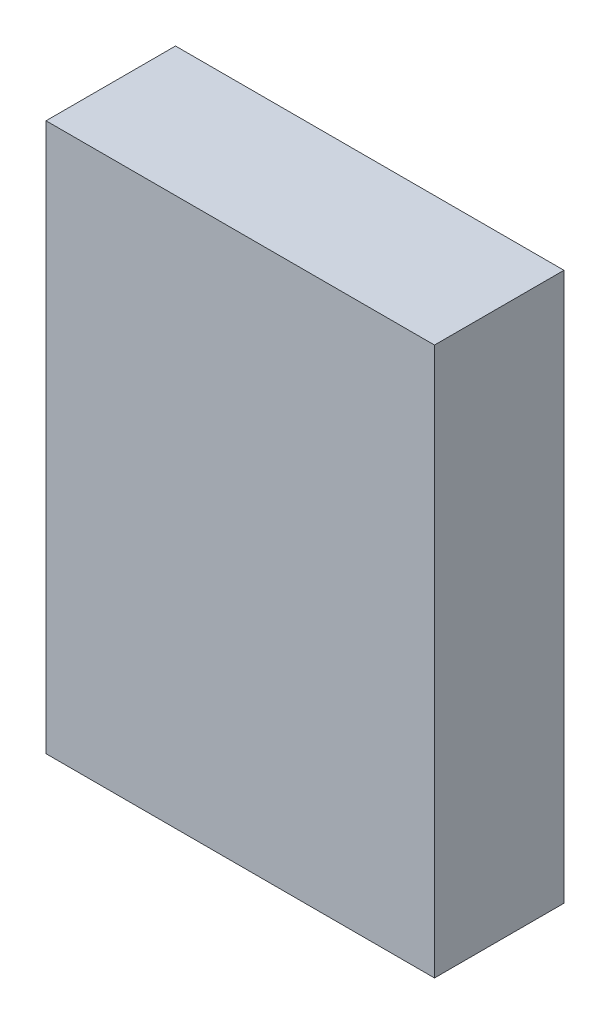
ISO-10303-21;
HEADER;
FILE_DESCRIPTION(('STEP AP214'),'2;1');
FILE_NAME('part.step','',(''),(''),'','','');
FILE_SCHEMA(('AUTOMOTIVE_DESIGN { 1 0 10303 214 1 1 1 1 }'));
ENDSEC;
DATA;
#1=APPLICATION_CONTEXT('core data for automotive mechanical design processes');
#2=APPLICATION_PROTOCOL_DEFINITION('international standard','automotive_design',2000,#1);
#3=PRODUCT_CONTEXT('',#1,'mechanical');
#4=PRODUCT('Part','Part','',(#3));
#5=PRODUCT_RELATED_PRODUCT_CATEGORY('part','',(#4));
#6=PRODUCT_DEFINITION_FORMATION('','',#4);
#7=PRODUCT_DEFINITION_CONTEXT('part definition',#1,'design');
#8=PRODUCT_DEFINITION('design','',#6,#7);
#9=PRODUCT_DEFINITION_SHAPE('','',#8);
#10=(LENGTH_UNIT() NAMED_UNIT(*) SI_UNIT(.MILLI.,.METRE.));
#11=(NAMED_UNIT(*) PLANE_ANGLE_UNIT() SI_UNIT($,.RADIAN.));
#12=(NAMED_UNIT(*) SI_UNIT($,.STERADIAN.) SOLID_ANGLE_UNIT());
#13=UNCERTAINTY_MEASURE_WITH_UNIT(LENGTH_MEASURE(1.E-05),#10,'distance_accuracy_value','');
#14=(GEOMETRIC_REPRESENTATION_CONTEXT(3) GLOBAL_UNCERTAINTY_ASSIGNED_CONTEXT((#13)) GLOBAL_UNIT_ASSIGNED_CONTEXT((#10,
#11,#12)) REPRESENTATION_CONTEXT('',''));
#15=CARTESIAN_POINT('',(0.,0.,0.));
#16=DIRECTION('',(0.,0.,1.));
#17=DIRECTION('',(1.,0.,0.));
#18=AXIS2_PLACEMENT_3D('',#15,#16,#17);
#19=CARTESIAN_POINT('',(0.,0.,3.));
#20=DIRECTION('',(1.,0.,0.));
#21=DIRECTION('',(0.,0.,-1.));
#22=AXIS2_PLACEMENT_3D('',#19,#20,#21);
#23=PLANE('',#22);
#24=DIRECTION('',(0.,-1.,0.));
#25=VECTOR('',#24,1.);
#26=CARTESIAN_POINT('',(0.,0.,0.));
#27=LINE('',#26,#25);
#28=CARTESIAN_POINT('',(0.,12.7,0.));
#29=VERTEX_POINT('',#28);
#30=CARTESIAN_POINT('',(0.,0.,0.));
#31=VERTEX_POINT('',#30);
#32=EDGE_CURVE('E96',#29,#31,#27,.T.);
#33=ORIENTED_EDGE('',*,*,#32,.T.);
#34=DIRECTION('',(0.,0.,-1.));
#35=VECTOR('',#34,1.);
#36=CARTESIAN_POINT('',(0.,0.,3.));
#37=LINE('',#36,#35);
#38=CARTESIAN_POINT('',(0.,0.,3.));
#39=VERTEX_POINT('',#38);
#40=EDGE_CURVE('E11',#39,#31,#37,.T.);
#41=ORIENTED_EDGE('',*,*,#40,.F.);
#42=DIRECTION('',(0.,-1.,0.));
#43=VECTOR('',#42,1.);
#44=CARTESIAN_POINT('',(0.,0.,3.));
#45=LINE('',#44,#43);
#46=CARTESIAN_POINT('',(0.,12.7,3.));
#47=VERTEX_POINT('',#46);
#48=EDGE_CURVE('E84',#47,#39,#45,.T.);
#49=ORIENTED_EDGE('',*,*,#48,.F.);
#50=DIRECTION('',(0.,0.,-1.));
#51=VECTOR('',#50,1.);
#52=CARTESIAN_POINT('',(0.,12.7,3.));
#53=LINE('',#52,#51);
#54=EDGE_CURVE('E92',#47,#29,#53,.T.);
#55=ORIENTED_EDGE('',*,*,#54,.T.);
#56=EDGE_LOOP('',(#33,#41,#49,#55));
#57=FACE_BOUND('',#56,.T.);
#58=ADVANCED_FACE('F33',(#57),#23,.F.);
#59=CARTESIAN_POINT('',(0.,0.,3.));
#60=DIRECTION('',(0.,1.,0.));
#61=DIRECTION('',(0.,0.,1.));
#62=AXIS2_PLACEMENT_3D('',#59,#60,#61);
#63=PLANE('',#62);
#64=DIRECTION('',(1.,0.,0.));
#65=VECTOR('',#64,1.);
#66=CARTESIAN_POINT('',(0.,0.,0.));
#67=LINE('',#66,#65);
#68=CARTESIAN_POINT('',(9.,0.,0.));
#69=VERTEX_POINT('',#68);
#70=EDGE_CURVE('E88',#31,#69,#67,.T.);
#71=ORIENTED_EDGE('',*,*,#70,.T.);
#72=DIRECTION('',(0.,0.,-1.));
#73=VECTOR('',#72,1.);
#74=CARTESIAN_POINT('',(9.,0.,3.));
#75=LINE('',#74,#73);
#76=CARTESIAN_POINT('',(9.,0.,3.));
#77=VERTEX_POINT('',#76);
#78=EDGE_CURVE('E41',#77,#69,#75,.T.);
#79=ORIENTED_EDGE('',*,*,#78,.F.);
#80=DIRECTION('',(1.,0.,0.));
#81=VECTOR('',#80,1.);
#82=CARTESIAN_POINT('',(0.,0.,3.));
#83=LINE('',#82,#81);
#84=EDGE_CURVE('E79',#39,#77,#83,.T.);
#85=ORIENTED_EDGE('',*,*,#84,.F.);
#86=ORIENTED_EDGE('',*,*,#40,.T.);
#87=EDGE_LOOP('',(#71,#79,#85,#86));
#88=FACE_BOUND('',#87,.T.);
#89=ADVANCED_FACE('F87',(#88),#63,.F.);
#90=CARTESIAN_POINT('',(9.,0.,3.));
#91=DIRECTION('',(-1.,0.,0.));
#92=DIRECTION('',(0.,0.,1.));
#93=AXIS2_PLACEMENT_3D('',#90,#91,#92);
#94=PLANE('',#93);
#95=DIRECTION('',(0.,1.,0.));
#96=VECTOR('',#95,1.);
#97=CARTESIAN_POINT('',(9.,0.,0.));
#98=LINE('',#97,#96);
#99=CARTESIAN_POINT('',(9.,12.7,0.));
#100=VERTEX_POINT('',#99);
#101=EDGE_CURVE('E66',#69,#100,#98,.T.);
#102=ORIENTED_EDGE('',*,*,#101,.T.);
#103=DIRECTION('',(0.,0.,-1.));
#104=VECTOR('',#103,1.);
#105=CARTESIAN_POINT('',(9.,12.7,3.));
#106=LINE('',#105,#104);
#107=CARTESIAN_POINT('',(9.,12.7,3.));
#108=VERTEX_POINT('',#107);
#109=EDGE_CURVE('E89',#108,#100,#106,.T.);
#110=ORIENTED_EDGE('',*,*,#109,.F.);
#111=DIRECTION('',(0.,1.,0.));
#112=VECTOR('',#111,1.);
#113=CARTESIAN_POINT('',(9.,0.,3.));
#114=LINE('',#113,#112);
#115=EDGE_CURVE('E82',#77,#108,#114,.T.);
#116=ORIENTED_EDGE('',*,*,#115,.F.);
#117=ORIENTED_EDGE('',*,*,#78,.T.);
#118=EDGE_LOOP('',(#102,#110,#116,#117));
#119=FACE_BOUND('',#118,.T.);
#120=ADVANCED_FACE('F90',(#119),#94,.F.);
#121=CARTESIAN_POINT('',(0.,12.7,3.));
#122=DIRECTION('',(0.,-1.,0.));
#123=DIRECTION('',(0.,0.,-1.));
#124=AXIS2_PLACEMENT_3D('',#121,#122,#123);
#125=PLANE('',#124);
#126=DIRECTION('',(-1.,0.,0.));
#127=VECTOR('',#126,1.);
#128=CARTESIAN_POINT('',(0.,12.7,0.));
#129=LINE('',#128,#127);
#130=EDGE_CURVE('E72',#100,#29,#129,.T.);
#131=ORIENTED_EDGE('',*,*,#130,.T.);
#132=ORIENTED_EDGE('',*,*,#54,.F.);
#133=DIRECTION('',(-1.,0.,0.));
#134=VECTOR('',#133,1.);
#135=CARTESIAN_POINT('',(0.,12.7,3.));
#136=LINE('',#135,#134);
#137=EDGE_CURVE('E49',#108,#47,#136,.T.);
#138=ORIENTED_EDGE('',*,*,#137,.F.);
#139=ORIENTED_EDGE('',*,*,#109,.T.);
#140=EDGE_LOOP('',(#131,#132,#138,#139));
#141=FACE_BOUND('',#140,.T.);
#142=ADVANCED_FACE('F103',(#141),#125,.F.);
#143=CARTESIAN_POINT('',(0.,0.,3.));
#144=DIRECTION('',(0.,0.,-1.));
#145=DIRECTION('',(-1.,0.,0.));
#146=AXIS2_PLACEMENT_3D('',#143,#144,#145);
#147=PLANE('',#146);
#148=ORIENTED_EDGE('',*,*,#48,.T.);
#149=ORIENTED_EDGE('',*,*,#84,.T.);
#150=ORIENTED_EDGE('',*,*,#115,.T.);
#151=ORIENTED_EDGE('',*,*,#137,.T.);
#152=EDGE_LOOP('',(#148,#149,#150,#151));
#153=FACE_BOUND('',#152,.T.);
#154=ADVANCED_FACE('F80',(#153),#147,.F.);
#155=CARTESIAN_POINT('',(0.,0.,0.));
#156=DIRECTION('',(0.,0.,-1.));
#157=DIRECTION('',(-1.,0.,0.));
#158=AXIS2_PLACEMENT_3D('',#155,#156,#157);
#159=PLANE('',#158);
#160=ORIENTED_EDGE('',*,*,#32,.F.);
#161=ORIENTED_EDGE('',*,*,#130,.F.);
#162=ORIENTED_EDGE('',*,*,#101,.F.);
#163=ORIENTED_EDGE('',*,*,#70,.F.);
#164=EDGE_LOOP('',(#160,#161,#162,#163));
#165=FACE_BOUND('',#164,.T.);
#166=ADVANCED_FACE('F106',(#165),#159,.T.);
#167=CLOSED_SHELL('',(#58,#89,#120,#142,#154,#166));
#168=MANIFOLD_SOLID_BREP('B2',#167);
#169=ADVANCED_BREP_SHAPE_REPRESENTATION('',(#18,#168),#14);
#170=SHAPE_DEFINITION_REPRESENTATION(#9,#169);
ENDSEC;
END-ISO-10303-21;
